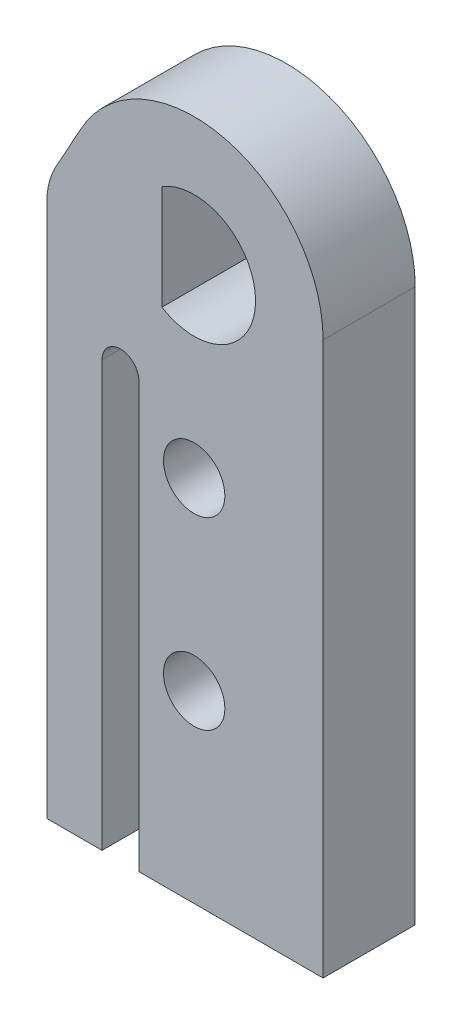
ISO-10303-21;
HEADER;
FILE_DESCRIPTION(('STEP AP214'),'2;1');
FILE_NAME('part.step','',(''),(''),'','','');
FILE_SCHEMA(('AUTOMOTIVE_DESIGN { 1 0 10303 214 1 1 1 1 }'));
ENDSEC;
DATA;
#1=APPLICATION_CONTEXT('core data for automotive mechanical design processes');
#2=APPLICATION_PROTOCOL_DEFINITION('international standard','automotive_design',2000,#1);
#3=PRODUCT_CONTEXT('',#1,'mechanical');
#4=PRODUCT('Part','Part','',(#3));
#5=PRODUCT_RELATED_PRODUCT_CATEGORY('part','',(#4));
#6=PRODUCT_DEFINITION_FORMATION('','',#4);
#7=PRODUCT_DEFINITION_CONTEXT('part definition',#1,'design');
#8=PRODUCT_DEFINITION('design','',#6,#7);
#9=PRODUCT_DEFINITION_SHAPE('','',#8);
#10=(LENGTH_UNIT() NAMED_UNIT(*) SI_UNIT(.MILLI.,.METRE.));
#11=(NAMED_UNIT(*) PLANE_ANGLE_UNIT() SI_UNIT($,.RADIAN.));
#12=(NAMED_UNIT(*) SI_UNIT($,.STERADIAN.) SOLID_ANGLE_UNIT());
#13=UNCERTAINTY_MEASURE_WITH_UNIT(LENGTH_MEASURE(1.E-05),#10,'distance_accuracy_value','');
#14=(GEOMETRIC_REPRESENTATION_CONTEXT(3) GLOBAL_UNCERTAINTY_ASSIGNED_CONTEXT((#13)) GLOBAL_UNIT_ASSIGNED_CONTEXT((#10,
#11,#12)) REPRESENTATION_CONTEXT('',''));
#15=CARTESIAN_POINT('',(0.,0.,0.));
#16=DIRECTION('',(0.,0.,1.));
#17=DIRECTION('',(1.,0.,0.));
#18=AXIS2_PLACEMENT_3D('',#15,#16,#17);
#19=CARTESIAN_POINT('',(-9.4021142162819,38.8579383291494,3.));
#20=DIRECTION('',(0.,0.,1.));
#21=DIRECTION('',(1.,0.,0.));
#22=AXIS2_PLACEMENT_3D('',#19,#20,#21);
#23=PLANE('',#22);
#24=CARTESIAN_POINT('',(-7.00211421628186,37.0148602673147,3.));
#25=DIRECTION('',(0.,0.,1.));
#26=DIRECTION('',(1.,0.,0.));
#27=AXIS2_PLACEMENT_3D('',#24,#25,#26);
#28=CIRCLE('',#27,0.999999999999998);
#29=CARTESIAN_POINT('',(-6.00211421628186,37.0148602673147,3.));
#30=VERTEX_POINT('',#29);
#31=EDGE_CURVE('E141',#30,#30,#28,.T.);
#32=ORIENTED_EDGE('',*,*,#31,.F.);
#33=EDGE_LOOP('',(#32));
#34=FACE_BOUND('',#33,.T.);
#35=CARTESIAN_POINT('',(-9.4021142162819,38.8579383291494,3.));
#36=DIRECTION('',(0.,0.,-1.));
#37=DIRECTION('',(1.,0.,0.));
#38=AXIS2_PLACEMENT_3D('',#35,#36,#37);
#39=CIRCLE('',#38,0.600000000000017);
#40=CARTESIAN_POINT('',(-10.0021142162819,38.8579383291494,3.));
#41=VERTEX_POINT('',#40);
#42=CARTESIAN_POINT('',(-8.80211421628185,38.8579383291494,3.));
#43=VERTEX_POINT('',#42);
#44=EDGE_CURVE('E145',#41,#43,#39,.T.);
#45=ORIENTED_EDGE('',*,*,#44,.T.);
#46=DIRECTION('',(0.,-1.,0.));
#47=VECTOR('',#46,1.);
#48=CARTESIAN_POINT('',(-8.80211421628185,25.0148602673147,3.));
#49=LINE('',#48,#47);
#50=CARTESIAN_POINT('',(-8.80211421628185,25.0148602673147,3.));
#51=VERTEX_POINT('',#50);
#52=EDGE_CURVE('E148',#43,#51,#49,.T.);
#53=ORIENTED_EDGE('',*,*,#52,.T.);
#54=DIRECTION('',(1.,0.,0.));
#55=VECTOR('',#54,1.);
#56=CARTESIAN_POINT('',(-8.80211421628185,25.0148602673147,3.));
#57=LINE('',#56,#55);
#58=CARTESIAN_POINT('',(-2.80211421628185,25.0148602673147,3.));
#59=VERTEX_POINT('',#58);
#60=EDGE_CURVE('E151',#51,#59,#57,.T.);
#61=ORIENTED_EDGE('',*,*,#60,.T.);
#62=DIRECTION('',(0.,1.,0.));
#63=VECTOR('',#62,1.);
#64=CARTESIAN_POINT('',(-2.80211421628185,25.0148602673147,3.));
#65=LINE('',#64,#63);
#66=CARTESIAN_POINT('',(-2.80211421628185,43.0148602673147,3.));
#67=VERTEX_POINT('',#66);
#68=EDGE_CURVE('E153',#59,#67,#65,.T.);
#69=ORIENTED_EDGE('',*,*,#68,.T.);
#70=CARTESIAN_POINT('',(-7.00211421628189,43.0148602673147,3.));
#71=DIRECTION('',(0.,0.,1.));
#72=DIRECTION('',(1.,0.,0.));
#73=AXIS2_PLACEMENT_3D('',#70,#71,#72);
#74=CIRCLE('',#73,4.20000000000002);
#75=CARTESIAN_POINT('',(-10.7074331768229,44.992386853901,3.));
#76=VERTEX_POINT('',#75);
#77=EDGE_CURVE('E155',#67,#76,#74,.T.);
#78=ORIENTED_EDGE('',*,*,#77,.T.);
#79=DIRECTION('',(-0.484308711135793,-0.874897178140373,0.));
#80=VECTOR('',#79,1.);
#81=CARTESIAN_POINT('',(-10.7074331768229,44.9923868539009,3.));
#82=LINE('',#81,#80);
#83=CARTESIAN_POINT('',(-11.5018674438186,43.5572520268139,3.));
#84=VERTEX_POINT('',#83);
#85=EDGE_CURVE('E157',#76,#84,#82,.T.);
#86=ORIENTED_EDGE('',*,*,#85,.T.);
#87=CARTESIAN_POINT('',(-9.4021142162819,42.3949111200877,3.));
#88=DIRECTION('',(0.,0.,1.));
#89=DIRECTION('',(1.,0.,0.));
#90=AXIS2_PLACEMENT_3D('',#87,#88,#89);
#91=CIRCLE('',#90,2.40000000000001);
#92=CARTESIAN_POINT('',(-11.8021142162819,42.3949111200878,3.));
#93=VERTEX_POINT('',#92);
#94=EDGE_CURVE('E159',#84,#93,#91,.T.);
#95=ORIENTED_EDGE('',*,*,#94,.T.);
#96=DIRECTION('',(0.,-1.,0.));
#97=VECTOR('',#96,1.);
#98=CARTESIAN_POINT('',(-11.8021142162819,42.3949111200878,3.));
#99=LINE('',#98,#97);
#100=CARTESIAN_POINT('',(-11.8021142162819,25.0148602673147,3.));
#101=VERTEX_POINT('',#100);
#102=EDGE_CURVE('E161',#93,#101,#99,.T.);
#103=ORIENTED_EDGE('',*,*,#102,.T.);
#104=DIRECTION('',(1.,0.,0.));
#105=VECTOR('',#104,1.);
#106=CARTESIAN_POINT('',(-11.8021142162819,25.0148602673147,3.));
#107=LINE('',#106,#105);
#108=CARTESIAN_POINT('',(-10.0021142162819,25.0148602673147,3.));
#109=VERTEX_POINT('',#108);
#110=EDGE_CURVE('E163',#101,#109,#107,.T.);
#111=ORIENTED_EDGE('',*,*,#110,.T.);
#112=DIRECTION('',(0.,1.,0.));
#113=VECTOR('',#112,1.);
#114=CARTESIAN_POINT('',(-10.0021142162819,38.8579383291494,3.));
#115=LINE('',#114,#113);
#116=EDGE_CURVE('E165',#109,#41,#115,.T.);
#117=ORIENTED_EDGE('',*,*,#116,.T.);
#118=EDGE_LOOP('',(#45,#53,#61,#69,#78,#86,#95,#103,#111,#117));
#119=FACE_BOUND('',#118,.T.);
#120=DIRECTION('',(0.,-1.,0.));
#121=VECTOR('',#120,1.);
#122=CARTESIAN_POINT('',(-8.05211421628183,43.0148602673147,3.));
#123=LINE('',#122,#121);
#124=CARTESIAN_POINT('',(-8.05211421628166,44.7170647203695,3.));
#125=VERTEX_POINT('',#124);
#126=CARTESIAN_POINT('',(-8.05211421628199,41.3126558142599,3.));
#127=VERTEX_POINT('',#126);
#128=EDGE_CURVE('E123',#125,#127,#123,.T.);
#129=ORIENTED_EDGE('',*,*,#128,.F.);
#130=CARTESIAN_POINT('',(-7.00211421628189,43.0148602673147,3.));
#131=DIRECTION('',(0.,0.,1.));
#132=DIRECTION('',(1.,0.,0.));
#133=AXIS2_PLACEMENT_3D('',#130,#131,#132);
#134=CIRCLE('',#133,1.99999999999998);
#135=EDGE_CURVE('E129',#127,#125,#134,.T.);
#136=ORIENTED_EDGE('',*,*,#135,.F.);
#137=EDGE_LOOP('',(#129,#136));
#138=FACE_BOUND('',#137,.T.);
#139=CARTESIAN_POINT('',(-7.00211421628188,31.0148602673147,3.));
#140=DIRECTION('',(0.,0.,1.));
#141=DIRECTION('',(1.,0.,0.));
#142=AXIS2_PLACEMENT_3D('',#139,#140,#141);
#143=CIRCLE('',#142,1.);
#144=CARTESIAN_POINT('',(-6.00211421628188,31.0148602673147,3.));
#145=VERTEX_POINT('',#144);
#146=EDGE_CURVE('E399',#145,#145,#143,.T.);
#147=ORIENTED_EDGE('',*,*,#146,.F.);
#148=EDGE_LOOP('',(#147));
#149=FACE_BOUND('',#148,.T.);
#150=ADVANCED_FACE('F35',(#34,#119,#138,#149),#23,.T.);
#151=CARTESIAN_POINT('',(-9.4021142162819,38.8579383291494,0.));
#152=DIRECTION('',(0.,0.,1.));
#153=DIRECTION('',(1.,0.,0.));
#154=AXIS2_PLACEMENT_3D('',#151,#152,#153);
#155=PLANE('',#154);
#156=CARTESIAN_POINT('',(-9.4021142162819,38.8579383291494,0.));
#157=DIRECTION('',(0.,0.,-1.));
#158=DIRECTION('',(1.,0.,0.));
#159=AXIS2_PLACEMENT_3D('',#156,#157,#158);
#160=CIRCLE('',#159,0.600000000000017);
#161=CARTESIAN_POINT('',(-10.0021142162819,38.8579383291494,0.));
#162=VERTEX_POINT('',#161);
#163=CARTESIAN_POINT('',(-8.80211421628185,38.8579383291494,0.));
#164=VERTEX_POINT('',#163);
#165=EDGE_CURVE('E144',#162,#164,#160,.T.);
#166=ORIENTED_EDGE('',*,*,#165,.F.);
#167=DIRECTION('',(0.,1.,0.));
#168=VECTOR('',#167,1.);
#169=CARTESIAN_POINT('',(-10.0021142162819,38.8579383291494,0.));
#170=LINE('',#169,#168);
#171=CARTESIAN_POINT('',(-10.0021142162819,25.0148602673147,0.));
#172=VERTEX_POINT('',#171);
#173=EDGE_CURVE('E149',#172,#162,#170,.T.);
#174=ORIENTED_EDGE('',*,*,#173,.F.);
#175=DIRECTION('',(1.,0.,0.));
#176=VECTOR('',#175,1.);
#177=CARTESIAN_POINT('',(-11.8021142162819,25.0148602673147,0.));
#178=LINE('',#177,#176);
#179=CARTESIAN_POINT('',(-11.8021142162819,25.0148602673147,0.));
#180=VERTEX_POINT('',#179);
#181=EDGE_CURVE('E184',#180,#172,#178,.T.);
#182=ORIENTED_EDGE('',*,*,#181,.F.);
#183=DIRECTION('',(0.,-1.,0.));
#184=VECTOR('',#183,1.);
#185=CARTESIAN_POINT('',(-11.8021142162819,42.3949111200878,0.));
#186=LINE('',#185,#184);
#187=CARTESIAN_POINT('',(-11.8021142162819,42.3949111200878,0.));
#188=VERTEX_POINT('',#187);
#189=EDGE_CURVE('E182',#188,#180,#186,.T.);
#190=ORIENTED_EDGE('',*,*,#189,.F.);
#191=CARTESIAN_POINT('',(-9.4021142162819,42.3949111200877,0.));
#192=DIRECTION('',(0.,0.,1.));
#193=DIRECTION('',(1.,0.,0.));
#194=AXIS2_PLACEMENT_3D('',#191,#192,#193);
#195=CIRCLE('',#194,2.40000000000001);
#196=CARTESIAN_POINT('',(-11.5018674438186,43.5572520268139,0.));
#197=VERTEX_POINT('',#196);
#198=EDGE_CURVE('E180',#197,#188,#195,.T.);
#199=ORIENTED_EDGE('',*,*,#198,.F.);
#200=DIRECTION('',(-0.484308711135793,-0.874897178140373,0.));
#201=VECTOR('',#200,1.);
#202=CARTESIAN_POINT('',(-10.7074331768229,44.9923868539009,0.));
#203=LINE('',#202,#201);
#204=CARTESIAN_POINT('',(-10.7074331768229,44.992386853901,0.));
#205=VERTEX_POINT('',#204);
#206=EDGE_CURVE('E178',#205,#197,#203,.T.);
#207=ORIENTED_EDGE('',*,*,#206,.F.);
#208=CARTESIAN_POINT('',(-7.00211421628189,43.0148602673147,0.));
#209=DIRECTION('',(0.,0.,1.));
#210=DIRECTION('',(1.,0.,0.));
#211=AXIS2_PLACEMENT_3D('',#208,#209,#210);
#212=CIRCLE('',#211,4.20000000000002);
#213=CARTESIAN_POINT('',(-2.80211421628185,43.0148602673147,0.));
#214=VERTEX_POINT('',#213);
#215=EDGE_CURVE('E176',#214,#205,#212,.T.);
#216=ORIENTED_EDGE('',*,*,#215,.F.);
#217=DIRECTION('',(0.,1.,0.));
#218=VECTOR('',#217,1.);
#219=CARTESIAN_POINT('',(-2.80211421628185,25.0148602673147,0.));
#220=LINE('',#219,#218);
#221=CARTESIAN_POINT('',(-2.80211421628185,25.0148602673147,0.));
#222=VERTEX_POINT('',#221);
#223=EDGE_CURVE('E174',#222,#214,#220,.T.);
#224=ORIENTED_EDGE('',*,*,#223,.F.);
#225=DIRECTION('',(1.,0.,0.));
#226=VECTOR('',#225,1.);
#227=CARTESIAN_POINT('',(-8.80211421628185,25.0148602673147,0.));
#228=LINE('',#227,#226);
#229=CARTESIAN_POINT('',(-8.80211421628185,25.0148602673147,0.));
#230=VERTEX_POINT('',#229);
#231=EDGE_CURVE('E172',#230,#222,#228,.T.);
#232=ORIENTED_EDGE('',*,*,#231,.F.);
#233=DIRECTION('',(0.,-1.,0.));
#234=VECTOR('',#233,1.);
#235=CARTESIAN_POINT('',(-8.80211421628185,25.0148602673147,0.));
#236=LINE('',#235,#234);
#237=EDGE_CURVE('E170',#164,#230,#236,.T.);
#238=ORIENTED_EDGE('',*,*,#237,.F.);
#239=EDGE_LOOP('',(#166,#174,#182,#190,#199,#207,#216,#224,#232,#238));
#240=FACE_BOUND('',#239,.T.);
#241=CARTESIAN_POINT('',(-7.00211421628189,43.0148602673147,0.));
#242=DIRECTION('',(0.,0.,1.));
#243=DIRECTION('',(1.,0.,0.));
#244=AXIS2_PLACEMENT_3D('',#241,#242,#243);
#245=CIRCLE('',#244,1.99999999999998);
#246=CARTESIAN_POINT('',(-8.05211421628199,41.3126558142599,0.));
#247=VERTEX_POINT('',#246);
#248=CARTESIAN_POINT('',(-8.05211421628199,44.7170647203695,0.));
#249=VERTEX_POINT('',#248);
#250=EDGE_CURVE('E57',#247,#249,#245,.T.);
#251=ORIENTED_EDGE('',*,*,#250,.T.);
#252=DIRECTION('',(0.,-1.,0.));
#253=VECTOR('',#252,1.);
#254=CARTESIAN_POINT('',(-8.05211421628183,43.0148602673147,0.));
#255=LINE('',#254,#253);
#256=EDGE_CURVE('E134',#249,#247,#255,.T.);
#257=ORIENTED_EDGE('',*,*,#256,.T.);
#258=EDGE_LOOP('',(#251,#257));
#259=FACE_BOUND('',#258,.T.);
#260=CARTESIAN_POINT('',(-7.00211421628186,37.0148602673147,0.));
#261=DIRECTION('',(0.,0.,1.));
#262=DIRECTION('',(1.,0.,0.));
#263=AXIS2_PLACEMENT_3D('',#260,#261,#262);
#264=CIRCLE('',#263,0.999999999999998);
#265=CARTESIAN_POINT('',(-6.00211421628186,37.0148602673147,0.));
#266=VERTEX_POINT('',#265);
#267=EDGE_CURVE('E138',#266,#266,#264,.T.);
#268=ORIENTED_EDGE('',*,*,#267,.T.);
#269=EDGE_LOOP('',(#268));
#270=FACE_BOUND('',#269,.T.);
#271=CARTESIAN_POINT('',(-7.00211421628188,31.0148602673147,0.));
#272=DIRECTION('',(0.,0.,1.));
#273=DIRECTION('',(1.,0.,0.));
#274=AXIS2_PLACEMENT_3D('',#271,#272,#273);
#275=CIRCLE('',#274,1.);
#276=CARTESIAN_POINT('',(-6.00211421628188,31.0148602673147,0.));
#277=VERTEX_POINT('',#276);
#278=EDGE_CURVE('E402',#277,#277,#275,.T.);
#279=ORIENTED_EDGE('',*,*,#278,.T.);
#280=EDGE_LOOP('',(#279));
#281=FACE_BOUND('',#280,.T.);
#282=ADVANCED_FACE('F220',(#240,#259,#270,#281),#155,.F.);
#283=CARTESIAN_POINT('',(-9.4021142162819,38.8579383291494,3.));
#284=DIRECTION('',(0.,0.,-1.));
#285=DIRECTION('',(-1.,0.,0.));
#286=AXIS2_PLACEMENT_3D('',#283,#284,#285);
#287=CYLINDRICAL_SURFACE('',#286,0.600000000000017);
#288=ORIENTED_EDGE('',*,*,#165,.T.);
#289=DIRECTION('',(0.,0.,-1.));
#290=VECTOR('',#289,1.);
#291=CARTESIAN_POINT('',(-8.80211421628185,38.8579383291494,3.));
#292=LINE('',#291,#290);
#293=EDGE_CURVE('E11',#43,#164,#292,.T.);
#294=ORIENTED_EDGE('',*,*,#293,.F.);
#295=ORIENTED_EDGE('',*,*,#44,.F.);
#296=DIRECTION('',(0.,0.,-1.));
#297=VECTOR('',#296,1.);
#298=CARTESIAN_POINT('',(-10.0021142162819,38.8579383291494,3.));
#299=LINE('',#298,#297);
#300=EDGE_CURVE('E167',#41,#162,#299,.T.);
#301=ORIENTED_EDGE('',*,*,#300,.T.);
#302=EDGE_LOOP('',(#288,#294,#295,#301));
#303=FACE_BOUND('',#302,.T.);
#304=ADVANCED_FACE('F37',(#303),#287,.F.);
#305=CARTESIAN_POINT('',(-8.80211421628185,25.0148602673147,3.));
#306=DIRECTION('',(1.,0.,0.));
#307=DIRECTION('',(0.,0.,-1.));
#308=AXIS2_PLACEMENT_3D('',#305,#306,#307);
#309=PLANE('',#308);
#310=ORIENTED_EDGE('',*,*,#237,.T.);
#311=DIRECTION('',(0.,0.,-1.));
#312=VECTOR('',#311,1.);
#313=CARTESIAN_POINT('',(-8.80211421628185,25.0148602673147,3.));
#314=LINE('',#313,#312);
#315=EDGE_CURVE('E43',#51,#230,#314,.T.);
#316=ORIENTED_EDGE('',*,*,#315,.F.);
#317=ORIENTED_EDGE('',*,*,#52,.F.);
#318=ORIENTED_EDGE('',*,*,#293,.T.);
#319=EDGE_LOOP('',(#310,#316,#317,#318));
#320=FACE_BOUND('',#319,.T.);
#321=ADVANCED_FACE('F237',(#320),#309,.F.);
#322=CARTESIAN_POINT('',(-8.80211421628185,25.0148602673147,3.));
#323=DIRECTION('',(0.,1.,0.));
#324=DIRECTION('',(0.,0.,1.));
#325=AXIS2_PLACEMENT_3D('',#322,#323,#324);
#326=PLANE('',#325);
#327=ORIENTED_EDGE('',*,*,#231,.T.);
#328=DIRECTION('',(0.,0.,-1.));
#329=VECTOR('',#328,1.);
#330=CARTESIAN_POINT('',(-2.80211421628185,25.0148602673147,3.));
#331=LINE('',#330,#329);
#332=EDGE_CURVE('E207',#59,#222,#331,.T.);
#333=ORIENTED_EDGE('',*,*,#332,.F.);
#334=ORIENTED_EDGE('',*,*,#60,.F.);
#335=ORIENTED_EDGE('',*,*,#315,.T.);
#336=EDGE_LOOP('',(#327,#333,#334,#335));
#337=FACE_BOUND('',#336,.T.);
#338=ADVANCED_FACE('F214',(#337),#326,.F.);
#339=CARTESIAN_POINT('',(-2.80211421628185,25.0148602673147,3.));
#340=DIRECTION('',(-1.,0.,0.));
#341=DIRECTION('',(0.,0.,1.));
#342=AXIS2_PLACEMENT_3D('',#339,#340,#341);
#343=PLANE('',#342);
#344=ORIENTED_EDGE('',*,*,#223,.T.);
#345=DIRECTION('',(0.,0.,-1.));
#346=VECTOR('',#345,1.);
#347=CARTESIAN_POINT('',(-2.80211421628185,43.0148602673147,3.));
#348=LINE('',#347,#346);
#349=EDGE_CURVE('E204',#67,#214,#348,.T.);
#350=ORIENTED_EDGE('',*,*,#349,.F.);
#351=ORIENTED_EDGE('',*,*,#68,.F.);
#352=ORIENTED_EDGE('',*,*,#332,.T.);
#353=EDGE_LOOP('',(#344,#350,#351,#352));
#354=FACE_BOUND('',#353,.T.);
#355=ADVANCED_FACE('F226',(#354),#343,.F.);
#356=CARTESIAN_POINT('',(-7.00211421628189,43.0148602673147,3.));
#357=DIRECTION('',(0.,0.,-1.));
#358=DIRECTION('',(-1.,0.,0.));
#359=AXIS2_PLACEMENT_3D('',#356,#357,#358);
#360=CYLINDRICAL_SURFACE('',#359,4.20000000000002);
#361=ORIENTED_EDGE('',*,*,#215,.T.);
#362=DIRECTION('',(0.,0.,-1.));
#363=VECTOR('',#362,1.);
#364=CARTESIAN_POINT('',(-10.7074331768229,44.992386853901,3.));
#365=LINE('',#364,#363);
#366=EDGE_CURVE('E201',#76,#205,#365,.T.);
#367=ORIENTED_EDGE('',*,*,#366,.F.);
#368=ORIENTED_EDGE('',*,*,#77,.F.);
#369=ORIENTED_EDGE('',*,*,#349,.T.);
#370=EDGE_LOOP('',(#361,#367,#368,#369));
#371=FACE_BOUND('',#370,.T.);
#372=ADVANCED_FACE('F230',(#371),#360,.T.);
#373=CARTESIAN_POINT('',(-10.7074331768229,44.9923868539009,3.));
#374=DIRECTION('',(0.874897178140373,-0.484308711135793,0.));
#375=DIRECTION('',(0.484308711135793,0.874897178140373,0.));
#376=AXIS2_PLACEMENT_3D('',#373,#374,#375);
#377=PLANE('',#376);
#378=ORIENTED_EDGE('',*,*,#206,.T.);
#379=DIRECTION('',(0.,0.,-1.));
#380=VECTOR('',#379,1.);
#381=CARTESIAN_POINT('',(-11.5018674438186,43.5572520268139,3.));
#382=LINE('',#381,#380);
#383=EDGE_CURVE('E198',#84,#197,#382,.T.);
#384=ORIENTED_EDGE('',*,*,#383,.F.);
#385=ORIENTED_EDGE('',*,*,#85,.F.);
#386=ORIENTED_EDGE('',*,*,#366,.T.);
#387=EDGE_LOOP('',(#378,#384,#385,#386));
#388=FACE_BOUND('',#387,.T.);
#389=ADVANCED_FACE('F260',(#388),#377,.F.);
#390=CARTESIAN_POINT('',(-9.4021142162819,42.3949111200877,3.));
#391=DIRECTION('',(0.,0.,-1.));
#392=DIRECTION('',(-1.,0.,0.));
#393=AXIS2_PLACEMENT_3D('',#390,#391,#392);
#394=CYLINDRICAL_SURFACE('',#393,2.40000000000001);
#395=ORIENTED_EDGE('',*,*,#198,.T.);
#396=DIRECTION('',(0.,0.,-1.));
#397=VECTOR('',#396,1.);
#398=CARTESIAN_POINT('',(-11.8021142162819,42.3949111200878,3.));
#399=LINE('',#398,#397);
#400=EDGE_CURVE('E195',#93,#188,#399,.T.);
#401=ORIENTED_EDGE('',*,*,#400,.F.);
#402=ORIENTED_EDGE('',*,*,#94,.F.);
#403=ORIENTED_EDGE('',*,*,#383,.T.);
#404=EDGE_LOOP('',(#395,#401,#402,#403));
#405=FACE_BOUND('',#404,.T.);
#406=ADVANCED_FACE('F257',(#405),#394,.T.);
#407=CARTESIAN_POINT('',(-11.8021142162819,42.3949111200878,3.));
#408=DIRECTION('',(1.,0.,0.));
#409=DIRECTION('',(0.,1.,0.));
#410=AXIS2_PLACEMENT_3D('',#407,#408,#409);
#411=PLANE('',#410);
#412=ORIENTED_EDGE('',*,*,#189,.T.);
#413=DIRECTION('',(0.,0.,-1.));
#414=VECTOR('',#413,1.);
#415=CARTESIAN_POINT('',(-11.8021142162819,25.0148602673147,3.));
#416=LINE('',#415,#414);
#417=EDGE_CURVE('E192',#101,#180,#416,.T.);
#418=ORIENTED_EDGE('',*,*,#417,.F.);
#419=ORIENTED_EDGE('',*,*,#102,.F.);
#420=ORIENTED_EDGE('',*,*,#400,.T.);
#421=EDGE_LOOP('',(#412,#418,#419,#420));
#422=FACE_BOUND('',#421,.T.);
#423=ADVANCED_FACE('F253',(#422),#411,.F.);
#424=CARTESIAN_POINT('',(-11.8021142162819,25.0148602673147,3.));
#425=DIRECTION('',(0.,1.,0.));
#426=DIRECTION('',(0.,0.,1.));
#427=AXIS2_PLACEMENT_3D('',#424,#425,#426);
#428=PLANE('',#427);
#429=ORIENTED_EDGE('',*,*,#181,.T.);
#430=DIRECTION('',(0.,0.,-1.));
#431=VECTOR('',#430,1.);
#432=CARTESIAN_POINT('',(-10.0021142162819,25.0148602673147,3.));
#433=LINE('',#432,#431);
#434=EDGE_CURVE('E189',#109,#172,#433,.T.);
#435=ORIENTED_EDGE('',*,*,#434,.F.);
#436=ORIENTED_EDGE('',*,*,#110,.F.);
#437=ORIENTED_EDGE('',*,*,#417,.T.);
#438=EDGE_LOOP('',(#429,#435,#436,#437));
#439=FACE_BOUND('',#438,.T.);
#440=ADVANCED_FACE('F249',(#439),#428,.F.);
#441=CARTESIAN_POINT('',(-10.0021142162819,38.8579383291494,3.));
#442=DIRECTION('',(-1.,0.,0.));
#443=DIRECTION('',(0.,0.,1.));
#444=AXIS2_PLACEMENT_3D('',#441,#442,#443);
#445=PLANE('',#444);
#446=ORIENTED_EDGE('',*,*,#173,.T.);
#447=ORIENTED_EDGE('',*,*,#300,.F.);
#448=ORIENTED_EDGE('',*,*,#116,.F.);
#449=ORIENTED_EDGE('',*,*,#434,.T.);
#450=EDGE_LOOP('',(#446,#447,#448,#449));
#451=FACE_BOUND('',#450,.T.);
#452=ADVANCED_FACE('F244',(#451),#445,.F.);
#453=CARTESIAN_POINT('',(-7.00211421628189,43.0148602673147,3.));
#454=DIRECTION('',(0.,0.,-1.));
#455=DIRECTION('',(-1.,0.,0.));
#456=AXIS2_PLACEMENT_3D('',#453,#454,#455);
#457=CYLINDRICAL_SURFACE('',#456,1.99999999999998);
#458=ORIENTED_EDGE('',*,*,#250,.F.);
#459=DIRECTION('',(0.,0.,-1.));
#460=VECTOR('',#459,1.);
#461=CARTESIAN_POINT('',(-8.05211421628199,41.3126558142599,3.));
#462=LINE('',#461,#460);
#463=EDGE_CURVE('E125',#127,#247,#462,.T.);
#464=ORIENTED_EDGE('',*,*,#463,.F.);
#465=ORIENTED_EDGE('',*,*,#135,.T.);
#466=DIRECTION('',(0.,0.,-1.));
#467=VECTOR('',#466,1.);
#468=CARTESIAN_POINT('',(-8.05211421628199,44.7170647203695,3.));
#469=LINE('',#468,#467);
#470=EDGE_CURVE('E50',#125,#249,#469,.T.);
#471=ORIENTED_EDGE('',*,*,#470,.T.);
#472=EDGE_LOOP('',(#458,#464,#465,#471));
#473=FACE_BOUND('',#472,.T.);
#474=ADVANCED_FACE('F131',(#473),#457,.F.);
#475=CARTESIAN_POINT('',(-8.05211421628183,43.0148602673147,3.));
#476=DIRECTION('',(1.,0.,0.));
#477=DIRECTION('',(0.,1.,0.));
#478=AXIS2_PLACEMENT_3D('',#475,#476,#477);
#479=PLANE('',#478);
#480=ORIENTED_EDGE('',*,*,#256,.F.);
#481=ORIENTED_EDGE('',*,*,#470,.F.);
#482=ORIENTED_EDGE('',*,*,#128,.T.);
#483=ORIENTED_EDGE('',*,*,#463,.T.);
#484=EDGE_LOOP('',(#480,#481,#482,#483));
#485=FACE_BOUND('',#484,.T.);
#486=ADVANCED_FACE('F124',(#485),#479,.T.);
#487=CARTESIAN_POINT('',(-7.00211421628186,37.0148602673147,3.));
#488=DIRECTION('',(0.,0.,-1.));
#489=DIRECTION('',(-1.,0.,0.));
#490=AXIS2_PLACEMENT_3D('',#487,#488,#489);
#491=CYLINDRICAL_SURFACE('',#490,0.999999999999998);
#492=ORIENTED_EDGE('',*,*,#31,.T.);
#493=EDGE_LOOP('',(#492));
#494=FACE_BOUND('',#493,.T.);
#495=ORIENTED_EDGE('',*,*,#267,.F.);
#496=EDGE_LOOP('',(#495));
#497=FACE_BOUND('',#496,.T.);
#498=ADVANCED_FACE('F308',(#494,#497),#491,.F.);
#499=CARTESIAN_POINT('',(-7.00211421628188,31.0148602673147,3.));
#500=DIRECTION('',(0.,0.,-1.));
#501=DIRECTION('',(-1.,0.,0.));
#502=AXIS2_PLACEMENT_3D('',#499,#500,#501);
#503=CYLINDRICAL_SURFACE('',#502,1.);
#504=ORIENTED_EDGE('',*,*,#146,.T.);
#505=EDGE_LOOP('',(#504));
#506=FACE_BOUND('',#505,.T.);
#507=ORIENTED_EDGE('',*,*,#278,.F.);
#508=EDGE_LOOP('',(#507));
#509=FACE_BOUND('',#508,.T.);
#510=ADVANCED_FACE('F314',(#506,#509),#503,.F.);
#511=CLOSED_SHELL('',(#150,#282,#304,#321,#338,#355,#372,#389,#406,#423,#440,#452,#474,#486,
#498,#510));
#512=MANIFOLD_SOLID_BREP('B2',#511);
#513=ADVANCED_BREP_SHAPE_REPRESENTATION('',(#18,#512),#14);
#514=SHAPE_DEFINITION_REPRESENTATION(#9,#513);
ENDSEC;
END-ISO-10303-21;
